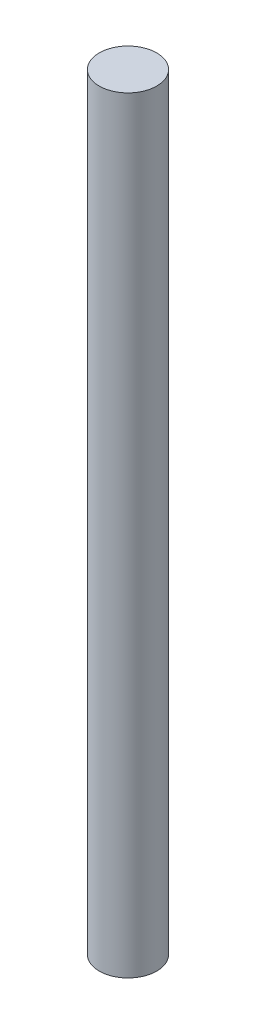
ISO-10303-21;
HEADER;
FILE_DESCRIPTION(('STEP AP214'),'2;1');
FILE_NAME('part.step','',(''),(''),'','','');
FILE_SCHEMA(('AUTOMOTIVE_DESIGN { 1 0 10303 214 1 1 1 1 }'));
ENDSEC;
DATA;
#1=APPLICATION_CONTEXT('core data for automotive mechanical design processes');
#2=APPLICATION_PROTOCOL_DEFINITION('international standard','automotive_design',2000,#1);
#3=PRODUCT_CONTEXT('',#1,'mechanical');
#4=PRODUCT('Part','Part','',(#3));
#5=PRODUCT_RELATED_PRODUCT_CATEGORY('part','',(#4));
#6=PRODUCT_DEFINITION_FORMATION('','',#4);
#7=PRODUCT_DEFINITION_CONTEXT('part definition',#1,'design');
#8=PRODUCT_DEFINITION('design','',#6,#7);
#9=PRODUCT_DEFINITION_SHAPE('','',#8);
#10=(LENGTH_UNIT() NAMED_UNIT(*) SI_UNIT(.MILLI.,.METRE.));
#11=(NAMED_UNIT(*) PLANE_ANGLE_UNIT() SI_UNIT($,.RADIAN.));
#12=(NAMED_UNIT(*) SI_UNIT($,.STERADIAN.) SOLID_ANGLE_UNIT());
#13=UNCERTAINTY_MEASURE_WITH_UNIT(LENGTH_MEASURE(1.E-05),#10,'distance_accuracy_value','');
#14=(GEOMETRIC_REPRESENTATION_CONTEXT(3) GLOBAL_UNCERTAINTY_ASSIGNED_CONTEXT((#13)) GLOBAL_UNIT_ASSIGNED_CONTEXT((#10,
#11,#12)) REPRESENTATION_CONTEXT('',''));
#15=CARTESIAN_POINT('',(0.,0.,0.));
#16=DIRECTION('',(0.,0.,1.));
#17=DIRECTION('',(1.,0.,0.));
#18=AXIS2_PLACEMENT_3D('',#15,#16,#17);
#19=CARTESIAN_POINT('',(0.,50.8,0.));
#20=DIRECTION('',(0.,-1.,0.));
#21=DIRECTION('',(0.,0.,-1.));
#22=AXIS2_PLACEMENT_3D('',#19,#20,#21);
#23=CYLINDRICAL_SURFACE('',#22,1.905);
#24=CARTESIAN_POINT('',(0.,50.8,0.));
#25=DIRECTION('',(0.,1.,0.));
#26=DIRECTION('',(0.,0.,1.));
#27=AXIS2_PLACEMENT_3D('',#24,#25,#26);
#28=CIRCLE('',#27,1.905);
#29=CARTESIAN_POINT('',(0.,50.8,1.905));
#30=VERTEX_POINT('',#29);
#31=EDGE_CURVE('E10',#30,#30,#28,.T.);
#32=ORIENTED_EDGE('',*,*,#31,.F.);
#33=EDGE_LOOP('',(#32));
#34=FACE_BOUND('',#33,.T.);
#35=CARTESIAN_POINT('',(0.,0.,0.));
#36=DIRECTION('',(0.,1.,0.));
#37=DIRECTION('',(0.,0.,1.));
#38=AXIS2_PLACEMENT_3D('',#35,#36,#37);
#39=CIRCLE('',#38,1.905);
#40=CARTESIAN_POINT('',(0.,0.,1.905));
#41=VERTEX_POINT('',#40);
#42=EDGE_CURVE('E34',#41,#41,#39,.T.);
#43=ORIENTED_EDGE('',*,*,#42,.T.);
#44=EDGE_LOOP('',(#43));
#45=FACE_BOUND('',#44,.T.);
#46=ADVANCED_FACE('F31',(#34,#45),#23,.T.);
#47=CARTESIAN_POINT('',(0.,50.8,0.));
#48=DIRECTION('',(0.,1.,0.));
#49=DIRECTION('',(0.,0.,1.));
#50=AXIS2_PLACEMENT_3D('',#47,#48,#49);
#51=PLANE('',#50);
#52=ORIENTED_EDGE('',*,*,#31,.T.);
#53=EDGE_LOOP('',(#52));
#54=FACE_BOUND('',#53,.T.);
#55=ADVANCED_FACE('F46',(#54),#51,.T.);
#56=CARTESIAN_POINT('',(0.,0.,0.));
#57=DIRECTION('',(0.,1.,0.));
#58=DIRECTION('',(0.,0.,1.));
#59=AXIS2_PLACEMENT_3D('',#56,#57,#58);
#60=PLANE('',#59);
#61=ORIENTED_EDGE('',*,*,#42,.F.);
#62=EDGE_LOOP('',(#61));
#63=FACE_BOUND('',#62,.T.);
#64=ADVANCED_FACE('F44',(#63),#60,.F.);
#65=CLOSED_SHELL('',(#46,#55,#64));
#66=MANIFOLD_SOLID_BREP('B2',#65);
#67=ADVANCED_BREP_SHAPE_REPRESENTATION('',(#18,#66),#14);
#68=SHAPE_DEFINITION_REPRESENTATION(#9,#67);
ENDSEC;
END-ISO-10303-21;
